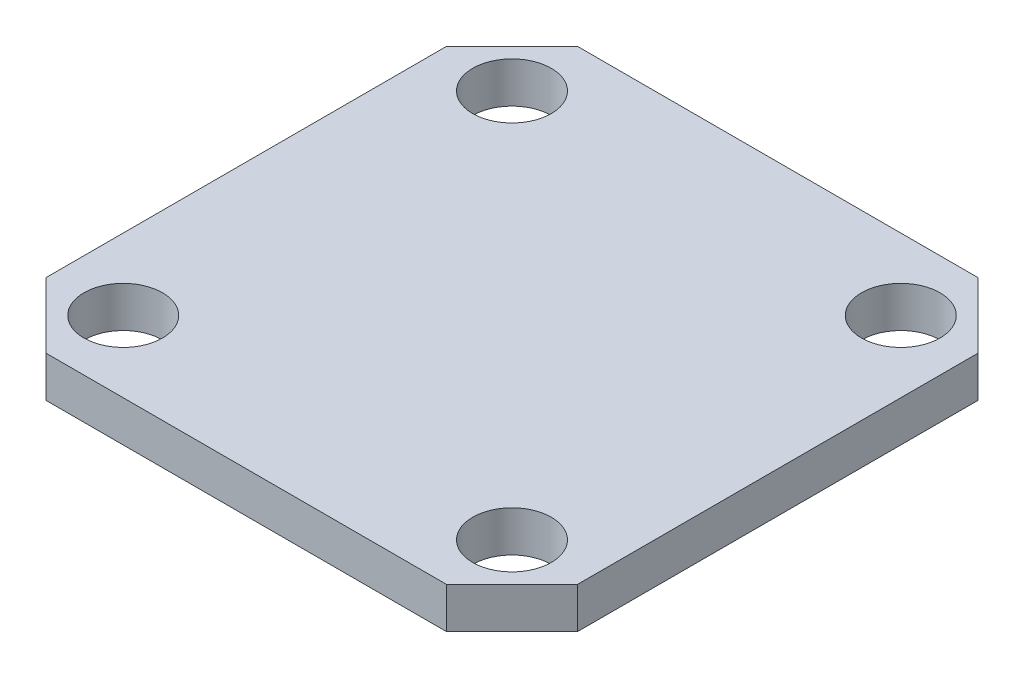
ISO-10303-21;
HEADER;
FILE_DESCRIPTION(('STEP AP214'),'2;1');
FILE_NAME('part.step','',(''),(''),'','','');
FILE_SCHEMA(('AUTOMOTIVE_DESIGN { 1 0 10303 214 1 1 1 1 }'));
ENDSEC;
DATA;
#1=APPLICATION_CONTEXT('core data for automotive mechanical design processes');
#2=APPLICATION_PROTOCOL_DEFINITION('international standard','automotive_design',2000,#1);
#3=PRODUCT_CONTEXT('',#1,'mechanical');
#4=PRODUCT('Part','Part','',(#3));
#5=PRODUCT_RELATED_PRODUCT_CATEGORY('part','',(#4));
#6=PRODUCT_DEFINITION_FORMATION('','',#4);
#7=PRODUCT_DEFINITION_CONTEXT('part definition',#1,'design');
#8=PRODUCT_DEFINITION('design','',#6,#7);
#9=PRODUCT_DEFINITION_SHAPE('','',#8);
#10=(LENGTH_UNIT() NAMED_UNIT(*) SI_UNIT(.MILLI.,.METRE.));
#11=(NAMED_UNIT(*) PLANE_ANGLE_UNIT() SI_UNIT($,.RADIAN.));
#12=(NAMED_UNIT(*) SI_UNIT($,.STERADIAN.) SOLID_ANGLE_UNIT());
#13=UNCERTAINTY_MEASURE_WITH_UNIT(LENGTH_MEASURE(1.E-05),#10,'distance_accuracy_value','');
#14=(GEOMETRIC_REPRESENTATION_CONTEXT(3) GLOBAL_UNCERTAINTY_ASSIGNED_CONTEXT((#13)) GLOBAL_UNIT_ASSIGNED_CONTEXT((#10,
#11,#12)) REPRESENTATION_CONTEXT('',''));
#15=CARTESIAN_POINT('',(0.,0.,0.));
#16=DIRECTION('',(0.,0.,1.));
#17=DIRECTION('',(1.,0.,0.));
#18=AXIS2_PLACEMENT_3D('',#15,#16,#17);
#19=CARTESIAN_POINT('',(10.3124,1.5875,-10.3124));
#20=DIRECTION('',(-1.,0.,0.));
#21=DIRECTION('',(0.,0.,1.));
#22=AXIS2_PLACEMENT_3D('',#19,#20,#21);
#23=PLANE('',#22);
#24=DIRECTION('',(0.,0.,-1.));
#25=VECTOR('',#24,1.);
#26=CARTESIAN_POINT('',(10.3124,0.,-10.3124));
#27=LINE('',#26,#25);
#28=CARTESIAN_POINT('',(10.3124,0.,7.7724));
#29=VERTEX_POINT('',#28);
#30=CARTESIAN_POINT('',(10.3124,0.,-7.77239999999999));
#31=VERTEX_POINT('',#30);
#32=EDGE_CURVE('E128',#29,#31,#27,.T.);
#33=ORIENTED_EDGE('',*,*,#32,.T.);
#34=DIRECTION('',(0.,1.,0.));
#35=VECTOR('',#34,1.);
#36=CARTESIAN_POINT('',(10.3124,1.5875,-7.77239999999999));
#37=LINE('',#36,#35);
#38=CARTESIAN_POINT('',(10.3124,1.5875,-7.77239999999999));
#39=VERTEX_POINT('',#38);
#40=EDGE_CURVE('E151',#31,#39,#37,.T.);
#41=ORIENTED_EDGE('',*,*,#40,.T.);
#42=DIRECTION('',(0.,0.,-1.));
#43=VECTOR('',#42,1.);
#44=CARTESIAN_POINT('',(10.3124,1.5875,-10.3124));
#45=LINE('',#44,#43);
#46=CARTESIAN_POINT('',(10.3124,1.5875,7.7724));
#47=VERTEX_POINT('',#46);
#48=EDGE_CURVE('E126',#47,#39,#45,.T.);
#49=ORIENTED_EDGE('',*,*,#48,.F.);
#50=DIRECTION('',(0.,-1.,0.));
#51=VECTOR('',#50,1.);
#52=CARTESIAN_POINT('',(10.3124,1.5875,7.7724));
#53=LINE('',#52,#51);
#54=EDGE_CURVE('E148',#47,#29,#53,.T.);
#55=ORIENTED_EDGE('',*,*,#54,.T.);
#56=EDGE_LOOP('',(#33,#41,#49,#55));
#57=FACE_BOUND('',#56,.T.);
#58=ADVANCED_FACE('F33',(#57),#23,.F.);
#59=CARTESIAN_POINT('',(-10.3124,1.5875,-10.3124));
#60=DIRECTION('',(0.,0.,1.));
#61=DIRECTION('',(1.,0.,0.));
#62=AXIS2_PLACEMENT_3D('',#59,#60,#61);
#63=PLANE('',#62);
#64=DIRECTION('',(-1.,0.,0.));
#65=VECTOR('',#64,1.);
#66=CARTESIAN_POINT('',(-10.3124,0.,-10.3124));
#67=LINE('',#66,#65);
#68=CARTESIAN_POINT('',(7.7724,0.,-10.3124));
#69=VERTEX_POINT('',#68);
#70=CARTESIAN_POINT('',(-7.77239999999999,0.,-10.3124));
#71=VERTEX_POINT('',#70);
#72=EDGE_CURVE('E124',#69,#71,#67,.T.);
#73=ORIENTED_EDGE('',*,*,#72,.T.);
#74=DIRECTION('',(0.,1.,0.));
#75=VECTOR('',#74,1.);
#76=CARTESIAN_POINT('',(-7.77239999999999,1.5875,-10.3124));
#77=LINE('',#76,#75);
#78=CARTESIAN_POINT('',(-7.77239999999999,1.5875,-10.3124));
#79=VERTEX_POINT('',#78);
#80=EDGE_CURVE('E103',#71,#79,#77,.T.);
#81=ORIENTED_EDGE('',*,*,#80,.T.);
#82=DIRECTION('',(-1.,0.,0.));
#83=VECTOR('',#82,1.);
#84=CARTESIAN_POINT('',(-10.3124,1.5875,-10.3124));
#85=LINE('',#84,#83);
#86=CARTESIAN_POINT('',(7.7724,1.5875,-10.3124));
#87=VERTEX_POINT('',#86);
#88=EDGE_CURVE('E167',#87,#79,#85,.T.);
#89=ORIENTED_EDGE('',*,*,#88,.F.);
#90=DIRECTION('',(0.,-1.,0.));
#91=VECTOR('',#90,1.);
#92=CARTESIAN_POINT('',(7.7724,1.5875,-10.3124));
#93=LINE('',#92,#91);
#94=EDGE_CURVE('E108',#87,#69,#93,.T.);
#95=ORIENTED_EDGE('',*,*,#94,.T.);
#96=EDGE_LOOP('',(#73,#81,#89,#95));
#97=FACE_BOUND('',#96,.T.);
#98=ADVANCED_FACE('F222',(#97),#63,.F.);
#99=CARTESIAN_POINT('',(-10.3124,1.5875,-10.3124));
#100=DIRECTION('',(1.,0.,0.));
#101=DIRECTION('',(0.,0.,-1.));
#102=AXIS2_PLACEMENT_3D('',#99,#100,#101);
#103=PLANE('',#102);
#104=DIRECTION('',(0.,0.,1.));
#105=VECTOR('',#104,1.);
#106=CARTESIAN_POINT('',(-10.3124,1.5875,-10.3124));
#107=LINE('',#106,#105);
#108=CARTESIAN_POINT('',(-10.3124,1.5875,-7.7724));
#109=VERTEX_POINT('',#108);
#110=CARTESIAN_POINT('',(-10.3124,1.5875,7.7724));
#111=VERTEX_POINT('',#110);
#112=EDGE_CURVE('E117',#109,#111,#107,.T.);
#113=ORIENTED_EDGE('',*,*,#112,.F.);
#114=DIRECTION('',(0.,-1.,0.));
#115=VECTOR('',#114,1.);
#116=CARTESIAN_POINT('',(-10.3124,1.5875,-7.7724));
#117=LINE('',#116,#115);
#118=CARTESIAN_POINT('',(-10.3124,0.,-7.7724));
#119=VERTEX_POINT('',#118);
#120=EDGE_CURVE('E102',#109,#119,#117,.T.);
#121=ORIENTED_EDGE('',*,*,#120,.T.);
#122=DIRECTION('',(0.,0.,1.));
#123=VECTOR('',#122,1.);
#124=CARTESIAN_POINT('',(-10.3124,0.,-10.3124));
#125=LINE('',#124,#123);
#126=CARTESIAN_POINT('',(-10.3124,0.,7.7724));
#127=VERTEX_POINT('',#126);
#128=EDGE_CURVE('E115',#119,#127,#125,.T.);
#129=ORIENTED_EDGE('',*,*,#128,.T.);
#130=DIRECTION('',(0.,1.,0.));
#131=VECTOR('',#130,1.);
#132=CARTESIAN_POINT('',(-10.3124,1.5875,7.7724));
#133=LINE('',#132,#131);
#134=EDGE_CURVE('E119',#127,#111,#133,.T.);
#135=ORIENTED_EDGE('',*,*,#134,.T.);
#136=EDGE_LOOP('',(#113,#121,#129,#135));
#137=FACE_BOUND('',#136,.T.);
#138=ADVANCED_FACE('F114',(#137),#103,.F.);
#139=CARTESIAN_POINT('',(-10.3124,1.5875,10.3124));
#140=DIRECTION('',(0.,0.,-1.));
#141=DIRECTION('',(-1.,0.,0.));
#142=AXIS2_PLACEMENT_3D('',#139,#140,#141);
#143=PLANE('',#142);
#144=DIRECTION('',(1.,0.,0.));
#145=VECTOR('',#144,1.);
#146=CARTESIAN_POINT('',(-10.3124,0.,10.3124));
#147=LINE('',#146,#145);
#148=CARTESIAN_POINT('',(-7.7724,0.,10.3124));
#149=VERTEX_POINT('',#148);
#150=CARTESIAN_POINT('',(7.77239999999999,0.,10.3124));
#151=VERTEX_POINT('',#150);
#152=EDGE_CURVE('E123',#149,#151,#147,.T.);
#153=ORIENTED_EDGE('',*,*,#152,.T.);
#154=DIRECTION('',(0.,1.,0.));
#155=VECTOR('',#154,1.);
#156=CARTESIAN_POINT('',(7.77239999999999,1.5875,10.3124));
#157=LINE('',#156,#155);
#158=CARTESIAN_POINT('',(7.77239999999999,1.5875,10.3124));
#159=VERTEX_POINT('',#158);
#160=EDGE_CURVE('E11',#151,#159,#157,.T.);
#161=ORIENTED_EDGE('',*,*,#160,.T.);
#162=DIRECTION('',(1.,0.,0.));
#163=VECTOR('',#162,1.);
#164=CARTESIAN_POINT('',(-10.3124,1.5875,10.3124));
#165=LINE('',#164,#163);
#166=CARTESIAN_POINT('',(-7.7724,1.5875,10.3124));
#167=VERTEX_POINT('',#166);
#168=EDGE_CURVE('E132',#167,#159,#165,.T.);
#169=ORIENTED_EDGE('',*,*,#168,.F.);
#170=DIRECTION('',(0.,-1.,0.));
#171=VECTOR('',#170,1.);
#172=CARTESIAN_POINT('',(-7.7724,1.5875,10.3124));
#173=LINE('',#172,#171);
#174=EDGE_CURVE('E41',#167,#149,#173,.T.);
#175=ORIENTED_EDGE('',*,*,#174,.T.);
#176=EDGE_LOOP('',(#153,#161,#169,#175));
#177=FACE_BOUND('',#176,.T.);
#178=ADVANCED_FACE('F154',(#177),#143,.F.);
#179=CARTESIAN_POINT('',(0.,1.5875,0.));
#180=DIRECTION('',(0.,1.,0.));
#181=DIRECTION('',(0.,0.,1.));
#182=AXIS2_PLACEMENT_3D('',#179,#180,#181);
#183=PLANE('',#182);
#184=CARTESIAN_POINT('',(7.5438,1.5875,-7.5438));
#185=DIRECTION('',(0.,1.,0.));
#186=DIRECTION('',(0.,0.,1.));
#187=AXIS2_PLACEMENT_3D('',#184,#185,#186);
#188=CIRCLE('',#187,1.524);
#189=CARTESIAN_POINT('',(7.5438,1.5875,-6.0198));
#190=VERTEX_POINT('',#189);
#191=EDGE_CURVE('E195',#190,#190,#188,.T.);
#192=ORIENTED_EDGE('',*,*,#191,.F.);
#193=EDGE_LOOP('',(#192));
#194=FACE_BOUND('',#193,.T.);
#195=CARTESIAN_POINT('',(7.5438,1.5875,7.5438));
#196=DIRECTION('',(0.,1.,0.));
#197=DIRECTION('',(0.,0.,1.));
#198=AXIS2_PLACEMENT_3D('',#195,#196,#197);
#199=CIRCLE('',#198,1.524);
#200=CARTESIAN_POINT('',(7.5438,1.5875,9.0678));
#201=VERTEX_POINT('',#200);
#202=EDGE_CURVE('E189',#201,#201,#199,.T.);
#203=ORIENTED_EDGE('',*,*,#202,.F.);
#204=EDGE_LOOP('',(#203));
#205=FACE_BOUND('',#204,.T.);
#206=CARTESIAN_POINT('',(-7.5438,1.5875,7.5438));
#207=DIRECTION('',(0.,1.,0.));
#208=DIRECTION('',(0.,0.,1.));
#209=AXIS2_PLACEMENT_3D('',#206,#207,#208);
#210=CIRCLE('',#209,1.524);
#211=CARTESIAN_POINT('',(-7.5438,1.5875,9.0678));
#212=VERTEX_POINT('',#211);
#213=EDGE_CURVE('E183',#212,#212,#210,.T.);
#214=ORIENTED_EDGE('',*,*,#213,.F.);
#215=EDGE_LOOP('',(#214));
#216=FACE_BOUND('',#215,.T.);
#217=CARTESIAN_POINT('',(-7.5438,1.5875,-7.5438));
#218=DIRECTION('',(0.,1.,0.));
#219=DIRECTION('',(0.,0.,1.));
#220=AXIS2_PLACEMENT_3D('',#217,#218,#219);
#221=CIRCLE('',#220,1.524);
#222=CARTESIAN_POINT('',(-7.5438,1.5875,-6.0198));
#223=VERTEX_POINT('',#222);
#224=EDGE_CURVE('E172',#223,#223,#221,.T.);
#225=ORIENTED_EDGE('',*,*,#224,.F.);
#226=EDGE_LOOP('',(#225));
#227=FACE_BOUND('',#226,.T.);
#228=ORIENTED_EDGE('',*,*,#88,.T.);
#229=DIRECTION('',(0.707106781186549,0.,-0.707106781186546));
#230=VECTOR('',#229,1.);
#231=CARTESIAN_POINT('',(-9.04239999999998,1.5875,-9.04240000000002));
#232=LINE('',#231,#230);
#233=EDGE_CURVE('E146',#79,#109,#232,.F.);
#234=ORIENTED_EDGE('',*,*,#233,.T.);
#235=ORIENTED_EDGE('',*,*,#112,.T.);
#236=DIRECTION('',(-0.707106781186547,0.,-0.707106781186548));
#237=VECTOR('',#236,1.);
#238=CARTESIAN_POINT('',(-9.04240000000001,1.5875,9.04239999999999));
#239=LINE('',#238,#237);
#240=EDGE_CURVE('E53',#111,#167,#239,.F.);
#241=ORIENTED_EDGE('',*,*,#240,.T.);
#242=ORIENTED_EDGE('',*,*,#168,.T.);
#243=DIRECTION('',(-0.707106781186549,0.,0.707106781186546));
#244=VECTOR('',#243,1.);
#245=CARTESIAN_POINT('',(9.04239999999998,1.5875,9.04240000000002));
#246=LINE('',#245,#244);
#247=EDGE_CURVE('E142',#159,#47,#246,.F.);
#248=ORIENTED_EDGE('',*,*,#247,.T.);
#249=ORIENTED_EDGE('',*,*,#48,.T.);
#250=DIRECTION('',(0.707106781186546,0.,0.707106781186549));
#251=VECTOR('',#250,1.);
#252=CARTESIAN_POINT('',(9.04240000000002,1.5875,-9.04239999999998));
#253=LINE('',#252,#251);
#254=EDGE_CURVE('E144',#39,#87,#253,.F.);
#255=ORIENTED_EDGE('',*,*,#254,.T.);
#256=EDGE_LOOP('',(#228,#234,#235,#241,#242,#248,#249,#255));
#257=FACE_BOUND('',#256,.T.);
#258=ADVANCED_FACE('F210',(#194,#205,#216,#227,#257),#183,.T.);
#259=CARTESIAN_POINT('',(0.,0.,0.));
#260=DIRECTION('',(0.,1.,0.));
#261=DIRECTION('',(0.,0.,1.));
#262=AXIS2_PLACEMENT_3D('',#259,#260,#261);
#263=PLANE('',#262);
#264=CARTESIAN_POINT('',(7.5438,0.,-7.5438));
#265=DIRECTION('',(0.,1.,0.));
#266=DIRECTION('',(0.,0.,1.));
#267=AXIS2_PLACEMENT_3D('',#264,#265,#266);
#268=CIRCLE('',#267,1.524);
#269=CARTESIAN_POINT('',(7.5438,0.,-6.0198));
#270=VERTEX_POINT('',#269);
#271=EDGE_CURVE('E181',#270,#270,#268,.T.);
#272=ORIENTED_EDGE('',*,*,#271,.T.);
#273=EDGE_LOOP('',(#272));
#274=FACE_BOUND('',#273,.T.);
#275=CARTESIAN_POINT('',(7.5438,0.,7.5438));
#276=DIRECTION('',(0.,1.,0.));
#277=DIRECTION('',(0.,0.,1.));
#278=AXIS2_PLACEMENT_3D('',#275,#276,#277);
#279=CIRCLE('',#278,1.524);
#280=CARTESIAN_POINT('',(7.5438,0.,9.0678));
#281=VERTEX_POINT('',#280);
#282=EDGE_CURVE('E192',#281,#281,#279,.T.);
#283=ORIENTED_EDGE('',*,*,#282,.T.);
#284=EDGE_LOOP('',(#283));
#285=FACE_BOUND('',#284,.T.);
#286=CARTESIAN_POINT('',(-7.5438,0.,7.5438));
#287=DIRECTION('',(0.,1.,0.));
#288=DIRECTION('',(0.,0.,1.));
#289=AXIS2_PLACEMENT_3D('',#286,#287,#288);
#290=CIRCLE('',#289,1.524);
#291=CARTESIAN_POINT('',(-7.5438,0.,9.0678));
#292=VERTEX_POINT('',#291);
#293=EDGE_CURVE('E186',#292,#292,#290,.T.);
#294=ORIENTED_EDGE('',*,*,#293,.T.);
#295=EDGE_LOOP('',(#294));
#296=FACE_BOUND('',#295,.T.);
#297=CARTESIAN_POINT('',(-7.5438,0.,-7.5438));
#298=DIRECTION('',(0.,1.,0.));
#299=DIRECTION('',(0.,0.,1.));
#300=AXIS2_PLACEMENT_3D('',#297,#298,#299);
#301=CIRCLE('',#300,1.524);
#302=CARTESIAN_POINT('',(-7.5438,0.,-6.0198));
#303=VERTEX_POINT('',#302);
#304=EDGE_CURVE('E176',#303,#303,#301,.T.);
#305=ORIENTED_EDGE('',*,*,#304,.T.);
#306=EDGE_LOOP('',(#305));
#307=FACE_BOUND('',#306,.T.);
#308=ORIENTED_EDGE('',*,*,#128,.F.);
#309=DIRECTION('',(-0.707106781186549,0.,0.707106781186546));
#310=VECTOR('',#309,1.);
#311=CARTESIAN_POINT('',(-10.3124,0.,-7.7724));
#312=LINE('',#311,#310);
#313=EDGE_CURVE('E98',#119,#71,#312,.F.);
#314=ORIENTED_EDGE('',*,*,#313,.T.);
#315=ORIENTED_EDGE('',*,*,#72,.F.);
#316=DIRECTION('',(-0.707106781186546,0.,-0.707106781186549));
#317=VECTOR('',#316,1.);
#318=CARTESIAN_POINT('',(7.7724,0.,-10.3124));
#319=LINE('',#318,#317);
#320=EDGE_CURVE('E109',#69,#31,#319,.F.);
#321=ORIENTED_EDGE('',*,*,#320,.T.);
#322=ORIENTED_EDGE('',*,*,#32,.F.);
#323=DIRECTION('',(0.707106781186549,0.,-0.707106781186546));
#324=VECTOR('',#323,1.);
#325=CARTESIAN_POINT('',(10.3124,0.,7.7724));
#326=LINE('',#325,#324);
#327=EDGE_CURVE('E135',#29,#151,#326,.F.);
#328=ORIENTED_EDGE('',*,*,#327,.T.);
#329=ORIENTED_EDGE('',*,*,#152,.F.);
#330=DIRECTION('',(0.707106781186547,0.,0.707106781186548));
#331=VECTOR('',#330,1.);
#332=CARTESIAN_POINT('',(-7.7724,0.,10.3124));
#333=LINE('',#332,#331);
#334=EDGE_CURVE('E118',#149,#127,#333,.F.);
#335=ORIENTED_EDGE('',*,*,#334,.T.);
#336=EDGE_LOOP('',(#308,#314,#315,#321,#322,#328,#329,#335));
#337=FACE_BOUND('',#336,.T.);
#338=ADVANCED_FACE('F121',(#274,#285,#296,#307,#337),#263,.F.);
#339=CARTESIAN_POINT('',(-10.3124,1.5875,-7.7724));
#340=DIRECTION('',(0.707106781186546,0.,0.707106781186549));
#341=DIRECTION('',(0.,-1.,0.));
#342=AXIS2_PLACEMENT_3D('',#339,#340,#341);
#343=PLANE('',#342);
#344=ORIENTED_EDGE('',*,*,#233,.F.);
#345=ORIENTED_EDGE('',*,*,#80,.F.);
#346=ORIENTED_EDGE('',*,*,#313,.F.);
#347=ORIENTED_EDGE('',*,*,#120,.F.);
#348=EDGE_LOOP('',(#344,#345,#346,#347));
#349=FACE_BOUND('',#348,.T.);
#350=ADVANCED_FACE('F101',(#349),#343,.F.);
#351=CARTESIAN_POINT('',(7.7724,1.5875,-10.3124));
#352=DIRECTION('',(-0.707106781186549,0.,0.707106781186546));
#353=DIRECTION('',(0.,-1.,0.));
#354=AXIS2_PLACEMENT_3D('',#351,#352,#353);
#355=PLANE('',#354);
#356=ORIENTED_EDGE('',*,*,#254,.F.);
#357=ORIENTED_EDGE('',*,*,#40,.F.);
#358=ORIENTED_EDGE('',*,*,#320,.F.);
#359=ORIENTED_EDGE('',*,*,#94,.F.);
#360=EDGE_LOOP('',(#356,#357,#358,#359));
#361=FACE_BOUND('',#360,.T.);
#362=ADVANCED_FACE('F224',(#361),#355,.F.);
#363=CARTESIAN_POINT('',(10.3124,1.5875,7.7724));
#364=DIRECTION('',(-0.707106781186546,0.,-0.707106781186549));
#365=DIRECTION('',(0.,-1.,0.));
#366=AXIS2_PLACEMENT_3D('',#363,#364,#365);
#367=PLANE('',#366);
#368=ORIENTED_EDGE('',*,*,#247,.F.);
#369=ORIENTED_EDGE('',*,*,#160,.F.);
#370=ORIENTED_EDGE('',*,*,#327,.F.);
#371=ORIENTED_EDGE('',*,*,#54,.F.);
#372=EDGE_LOOP('',(#368,#369,#370,#371));
#373=FACE_BOUND('',#372,.T.);
#374=ADVANCED_FACE('F161',(#373),#367,.F.);
#375=CARTESIAN_POINT('',(-7.7724,1.5875,10.3124));
#376=DIRECTION('',(0.707106781186548,0.,-0.707106781186547));
#377=DIRECTION('',(0.,-1.,0.));
#378=AXIS2_PLACEMENT_3D('',#375,#376,#377);
#379=PLANE('',#378);
#380=ORIENTED_EDGE('',*,*,#240,.F.);
#381=ORIENTED_EDGE('',*,*,#134,.F.);
#382=ORIENTED_EDGE('',*,*,#334,.F.);
#383=ORIENTED_EDGE('',*,*,#174,.F.);
#384=EDGE_LOOP('',(#380,#381,#382,#383));
#385=FACE_BOUND('',#384,.T.);
#386=ADVANCED_FACE('F35',(#385),#379,.F.);
#387=CARTESIAN_POINT('',(-7.5438,0.,-7.5438));
#388=DIRECTION('',(0.,1.,0.));
#389=DIRECTION('',(0.,0.,1.));
#390=AXIS2_PLACEMENT_3D('',#387,#388,#389);
#391=CYLINDRICAL_SURFACE('',#390,1.524);
#392=ORIENTED_EDGE('',*,*,#304,.F.);
#393=EDGE_LOOP('',(#392));
#394=FACE_BOUND('',#393,.T.);
#395=ORIENTED_EDGE('',*,*,#224,.T.);
#396=EDGE_LOOP('',(#395));
#397=FACE_BOUND('',#396,.T.);
#398=ADVANCED_FACE('F245',(#394,#397),#391,.F.);
#399=CARTESIAN_POINT('',(-7.5438,0.,7.5438));
#400=DIRECTION('',(0.,1.,0.));
#401=DIRECTION('',(0.,0.,1.));
#402=AXIS2_PLACEMENT_3D('',#399,#400,#401);
#403=CYLINDRICAL_SURFACE('',#402,1.524);
#404=ORIENTED_EDGE('',*,*,#293,.F.);
#405=EDGE_LOOP('',(#404));
#406=FACE_BOUND('',#405,.T.);
#407=ORIENTED_EDGE('',*,*,#213,.T.);
#408=EDGE_LOOP('',(#407));
#409=FACE_BOUND('',#408,.T.);
#410=ADVANCED_FACE('F248',(#406,#409),#403,.F.);
#411=CARTESIAN_POINT('',(7.5438,0.,7.5438));
#412=DIRECTION('',(0.,1.,0.));
#413=DIRECTION('',(0.,0.,1.));
#414=AXIS2_PLACEMENT_3D('',#411,#412,#413);
#415=CYLINDRICAL_SURFACE('',#414,1.524);
#416=ORIENTED_EDGE('',*,*,#282,.F.);
#417=EDGE_LOOP('',(#416));
#418=FACE_BOUND('',#417,.T.);
#419=ORIENTED_EDGE('',*,*,#202,.T.);
#420=EDGE_LOOP('',(#419));
#421=FACE_BOUND('',#420,.T.);
#422=ADVANCED_FACE('F206',(#418,#421),#415,.F.);
#423=CARTESIAN_POINT('',(7.5438,0.,-7.5438));
#424=DIRECTION('',(0.,1.,0.));
#425=DIRECTION('',(0.,0.,1.));
#426=AXIS2_PLACEMENT_3D('',#423,#424,#425);
#427=CYLINDRICAL_SURFACE('',#426,1.524);
#428=ORIENTED_EDGE('',*,*,#271,.F.);
#429=EDGE_LOOP('',(#428));
#430=FACE_BOUND('',#429,.T.);
#431=ORIENTED_EDGE('',*,*,#191,.T.);
#432=EDGE_LOOP('',(#431));
#433=FACE_BOUND('',#432,.T.);
#434=ADVANCED_FACE('F203',(#430,#433),#427,.F.);
#435=CLOSED_SHELL('',(#58,#98,#138,#178,#258,#338,#350,#362,#374,#386,#398,#410,#422,#434));
#436=MANIFOLD_SOLID_BREP('B2',#435);
#437=ADVANCED_BREP_SHAPE_REPRESENTATION('',(#18,#436),#14);
#438=SHAPE_DEFINITION_REPRESENTATION(#9,#437);
ENDSEC;
END-ISO-10303-21;
